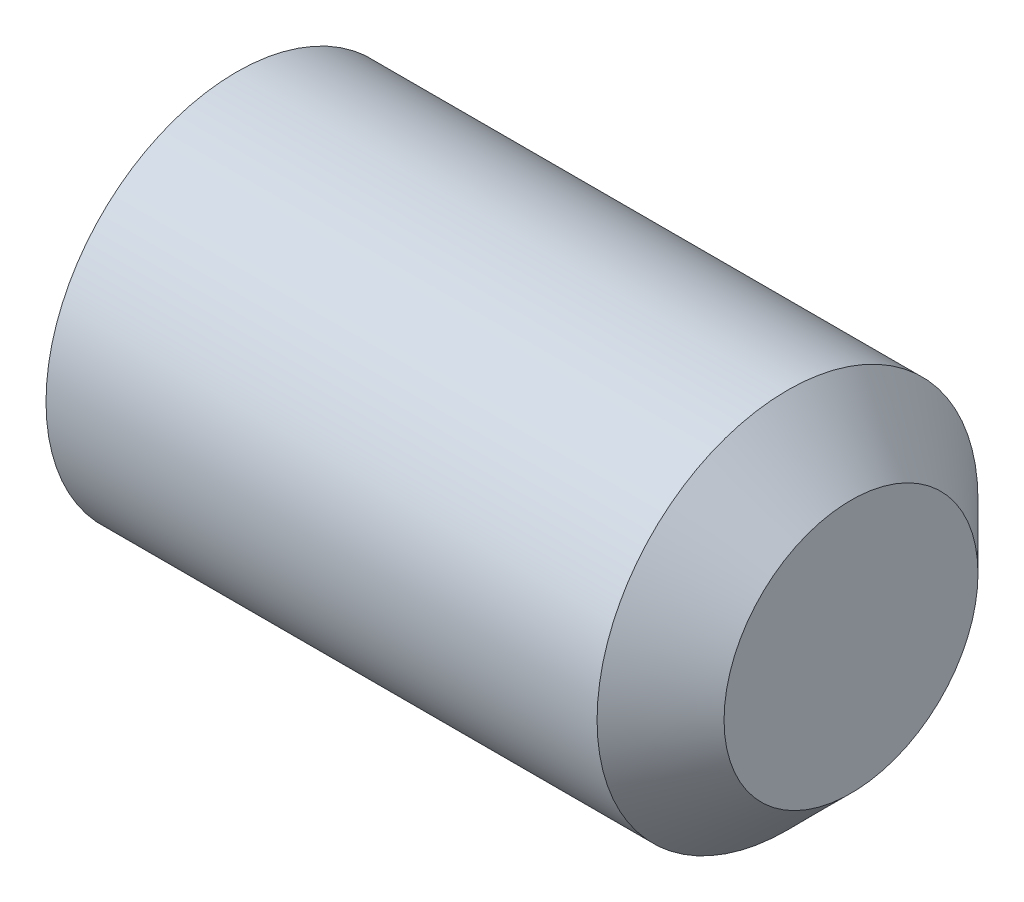
ISO-10303-21;
HEADER;
FILE_DESCRIPTION(('STEP AP214'),'2;1');
FILE_NAME('part.step','',(''),(''),'','','');
FILE_SCHEMA(('AUTOMOTIVE_DESIGN { 1 0 10303 214 1 1 1 1 }'));
ENDSEC;
DATA;
#1=APPLICATION_CONTEXT('core data for automotive mechanical design processes');
#2=APPLICATION_PROTOCOL_DEFINITION('international standard','automotive_design',2000,#1);
#3=PRODUCT_CONTEXT('',#1,'mechanical');
#4=PRODUCT('Part','Part','',(#3));
#5=PRODUCT_RELATED_PRODUCT_CATEGORY('part','',(#4));
#6=PRODUCT_DEFINITION_FORMATION('','',#4);
#7=PRODUCT_DEFINITION_CONTEXT('part definition',#1,'design');
#8=PRODUCT_DEFINITION('design','',#6,#7);
#9=PRODUCT_DEFINITION_SHAPE('','',#8);
#10=(LENGTH_UNIT() NAMED_UNIT(*) SI_UNIT(.MILLI.,.METRE.));
#11=(NAMED_UNIT(*) PLANE_ANGLE_UNIT() SI_UNIT($,.RADIAN.));
#12=(NAMED_UNIT(*) SI_UNIT($,.STERADIAN.) SOLID_ANGLE_UNIT());
#13=UNCERTAINTY_MEASURE_WITH_UNIT(LENGTH_MEASURE(1.E-05),#10,'distance_accuracy_value','');
#14=(GEOMETRIC_REPRESENTATION_CONTEXT(3) GLOBAL_UNCERTAINTY_ASSIGNED_CONTEXT((#13)) GLOBAL_UNIT_ASSIGNED_CONTEXT((#10,
#11,#12)) REPRESENTATION_CONTEXT('',''));
#15=CARTESIAN_POINT('',(0.,0.,0.));
#16=DIRECTION('',(0.,0.,1.));
#17=DIRECTION('',(1.,0.,0.));
#18=AXIS2_PLACEMENT_3D('',#15,#16,#17);
#19=CARTESIAN_POINT('',(0.,0.,0.));
#20=DIRECTION('',(-0.999999999999996,0.,0.));
#21=DIRECTION('',(0.,0.,0.999999999999996));
#22=AXIS2_PLACEMENT_3D('',#19,#20,#21);
#23=PLANE('',#22);
#24=CARTESIAN_POINT('',(0.,0.,0.));
#25=DIRECTION('',(-0.999999999999996,0.,0.));
#26=DIRECTION('',(0.,0.,0.999999999999996));
#27=AXIS2_PLACEMENT_3D('',#24,#25,#26);
#28=CIRCLE('',#27,2.4455);
#29=CARTESIAN_POINT('',(0.,0.,2.44549999999999));
#30=VERTEX_POINT('',#29);
#31=EDGE_CURVE('E138',#30,#30,#28,.T.);
#32=ORIENTED_EDGE('',*,*,#31,.T.);
#33=EDGE_LOOP('',(#32));
#34=FACE_BOUND('',#33,.T.);
#35=DIRECTION('',(0.,0.,-0.999999999999996));
#36=VECTOR('',#35,1.);
#37=CARTESIAN_POINT('',(0.,1.49999999999999,0.866025403784424));
#38=LINE('',#37,#36);
#39=CARTESIAN_POINT('',(0.,1.49999999999999,0.866025403784424));
#40=VERTEX_POINT('',#39);
#41=CARTESIAN_POINT('',(0.,1.49999999999998,-0.86602540378446));
#42=VERTEX_POINT('',#41);
#43=EDGE_CURVE('E129',#40,#42,#38,.T.);
#44=ORIENTED_EDGE('',*,*,#43,.F.);
#45=DIRECTION('',(0.,-0.86602540378444,0.499999999999998));
#46=VECTOR('',#45,1.);
#47=CARTESIAN_POINT('',(0.,1.49999999999999,0.866025403784424));
#48=LINE('',#47,#46);
#49=CARTESIAN_POINT('',(0.,0.,1.73205080756886));
#50=VERTEX_POINT('',#49);
#51=EDGE_CURVE('E51',#40,#50,#48,.T.);
#52=ORIENTED_EDGE('',*,*,#51,.T.);
#53=DIRECTION('',(0.,0.866025403784441,0.499999999999998));
#54=VECTOR('',#53,1.);
#55=CARTESIAN_POINT('',(0.,-1.50000000000002,0.866025403784419));
#56=LINE('',#55,#54);
#57=CARTESIAN_POINT('',(0.,-1.50000000000002,0.866025403784419));
#58=VERTEX_POINT('',#57);
#59=EDGE_CURVE('E120',#58,#50,#56,.T.);
#60=ORIENTED_EDGE('',*,*,#59,.F.);
#61=DIRECTION('',(0.,0.,-0.999999999999996));
#62=VECTOR('',#61,1.);
#63=CARTESIAN_POINT('',(0.,-1.50000000000002,0.866025403784419));
#64=LINE('',#63,#62);
#65=CARTESIAN_POINT('',(1.11022302462516E-13,-1.50000000000002,-0.866025403784436));
#66=VERTEX_POINT('',#65);
#67=EDGE_CURVE('E123',#58,#66,#64,.T.);
#68=ORIENTED_EDGE('',*,*,#67,.T.);
#69=DIRECTION('',(0.,0.86602540378444,-0.499999999999998));
#70=VECTOR('',#69,1.);
#71=CARTESIAN_POINT('',(1.11022302462516E-13,-1.50000000000002,-0.866025403784436));
#72=LINE('',#71,#70);
#73=CARTESIAN_POINT('',(1.66533453693773E-13,0.,-1.73205080756889));
#74=VERTEX_POINT('',#73);
#75=EDGE_CURVE('E126',#66,#74,#72,.T.);
#76=ORIENTED_EDGE('',*,*,#75,.T.);
#77=DIRECTION('',(0.,-0.86602540378444,-0.499999999999998));
#78=VECTOR('',#77,1.);
#79=CARTESIAN_POINT('',(0.,1.49999999999998,-0.86602540378446));
#80=LINE('',#79,#78);
#81=EDGE_CURVE('E109',#42,#74,#80,.T.);
#82=ORIENTED_EDGE('',*,*,#81,.F.);
#83=EDGE_LOOP('',(#44,#52,#60,#68,#76,#82));
#84=FACE_BOUND('',#83,.T.);
#85=ADVANCED_FACE('F36',(#34,#84),#23,.T.);
#86=CARTESIAN_POINT('',(10.,2.00000000000001,0.));
#87=DIRECTION('',(0.999999999999996,0.,0.));
#88=DIRECTION('',(0.,0.,-0.999999999999996));
#89=AXIS2_PLACEMENT_3D('',#86,#87,#88);
#90=PLANE('',#89);
#91=CARTESIAN_POINT('',(10.,0.,0.));
#92=DIRECTION('',(-0.999999999999996,0.,0.));
#93=DIRECTION('',(0.,0.,0.999999999999996));
#94=AXIS2_PLACEMENT_3D('',#91,#92,#93);
#95=CIRCLE('',#94,2.);
#96=CARTESIAN_POINT('',(10.,0.,1.99999999999998));
#97=VERTEX_POINT('',#96);
#98=EDGE_CURVE('E11',#97,#97,#95,.T.);
#99=ORIENTED_EDGE('',*,*,#98,.F.);
#100=EDGE_LOOP('',(#99));
#101=FACE_BOUND('',#100,.T.);
#102=ADVANCED_FACE('F38',(#101),#90,.T.);
#103=CARTESIAN_POINT('',(9.00000000000004,0.,0.));
#104=DIRECTION('',(-0.999999999999996,0.,0.));
#105=DIRECTION('',(0.,0.,0.999999999999996));
#106=AXIS2_PLACEMENT_3D('',#103,#104,#105);
#107=CONICAL_SURFACE('',#106,3.,0.785398163397464);
#108=CARTESIAN_POINT('',(9.00000000000004,0.,0.));
#109=DIRECTION('',(-0.999999999999996,0.,0.));
#110=DIRECTION('',(0.,0.,0.999999999999996));
#111=AXIS2_PLACEMENT_3D('',#108,#109,#110);
#112=CIRCLE('',#111,3.);
#113=CARTESIAN_POINT('',(9.00000000000004,0.,2.99999999999998));
#114=VERTEX_POINT('',#113);
#115=EDGE_CURVE('E44',#114,#114,#112,.T.);
#116=CARTESIAN_POINT('',(10.,0.,1.99999999999998));
#117=CARTESIAN_POINT('',(9.98958333333334,0.,2.01041666666665));
#118=CARTESIAN_POINT('',(9.97916666666667,0.,2.02083333333331));
#119=CARTESIAN_POINT('',(9.95833333333334,0.,2.04166666666665));
#120=CARTESIAN_POINT('',(9.94791666666667,0.,2.05208333333332));
#121=CARTESIAN_POINT('',(9.92708333333334,0.,2.07291666666665));
#122=CARTESIAN_POINT('',(9.91666666666667,0.,2.08333333333331));
#123=CARTESIAN_POINT('',(9.89583333333334,0.,2.10416666666665));
#124=CARTESIAN_POINT('',(9.88541666666667,0.,2.11458333333331));
#125=CARTESIAN_POINT('',(9.86458333333334,0.,2.13541666666665));
#126=CARTESIAN_POINT('',(9.85416666666667,0.,2.14583333333331));
#127=CARTESIAN_POINT('',(9.83333333333334,0.,2.16666666666665));
#128=CARTESIAN_POINT('',(9.82291666666668,0.,2.17708333333331));
#129=CARTESIAN_POINT('',(9.80208333333334,0.,2.19791666666665));
#130=CARTESIAN_POINT('',(9.79166666666668,0.,2.20833333333331));
#131=CARTESIAN_POINT('',(9.77083333333334,0.,2.22916666666665));
#132=CARTESIAN_POINT('',(9.76041666666668,0.,2.23958333333331));
#133=CARTESIAN_POINT('',(9.73958333333334,0.,2.26041666666665));
#134=CARTESIAN_POINT('',(9.72916666666668,0.,2.27083333333331));
#135=CARTESIAN_POINT('',(9.70833333333335,0.,2.29166666666665));
#136=CARTESIAN_POINT('',(9.69791666666668,0.,2.30208333333331));
#137=CARTESIAN_POINT('',(9.67708333333335,0.,2.32291666666665));
#138=CARTESIAN_POINT('',(9.66666666666668,0.,2.33333333333331));
#139=CARTESIAN_POINT('',(9.64583333333335,0.,2.35416666666665));
#140=CARTESIAN_POINT('',(9.63541666666668,0.,2.36458333333331));
#141=CARTESIAN_POINT('',(9.61458333333335,0.,2.38541666666665));
#142=CARTESIAN_POINT('',(9.60416666666668,0.,2.39583333333331));
#143=CARTESIAN_POINT('',(9.58333333333335,0.,2.41666666666665));
#144=CARTESIAN_POINT('',(9.57291666666668,0.,2.42708333333331));
#145=CARTESIAN_POINT('',(9.55208333333335,0.,2.44791666666665));
#146=CARTESIAN_POINT('',(9.54166666666668,0.,2.45833333333331));
#147=CARTESIAN_POINT('',(9.52083333333335,0.,2.47916666666665));
#148=CARTESIAN_POINT('',(9.51041666666669,0.,2.48958333333331));
#149=CARTESIAN_POINT('',(9.48958333333335,0.,2.51041666666665));
#150=CARTESIAN_POINT('',(9.47916666666669,0.,2.52083333333331));
#151=CARTESIAN_POINT('',(9.45833333333336,0.,2.54166666666665));
#152=CARTESIAN_POINT('',(9.44791666666669,0.,2.55208333333331));
#153=CARTESIAN_POINT('',(9.42708333333336,0.,2.57291666666665));
#154=CARTESIAN_POINT('',(9.41666666666669,0.,2.58333333333331));
#155=CARTESIAN_POINT('',(9.39583333333336,0.,2.60416666666665));
#156=CARTESIAN_POINT('',(9.38541666666669,0.,2.61458333333331));
#157=CARTESIAN_POINT('',(9.36458333333336,0.,2.63541666666665));
#158=CARTESIAN_POINT('',(9.35416666666669,0.,2.64583333333331));
#159=CARTESIAN_POINT('',(9.33333333333336,0.,2.66666666666665));
#160=CARTESIAN_POINT('',(9.32291666666669,0.,2.67708333333331));
#161=CARTESIAN_POINT('',(9.30208333333336,0.,2.69791666666665));
#162=CARTESIAN_POINT('',(9.29166666666669,0.,2.70833333333331));
#163=CARTESIAN_POINT('',(9.27083333333336,0.,2.72916666666665));
#164=CARTESIAN_POINT('',(9.26041666666669,0.,2.73958333333331));
#165=CARTESIAN_POINT('',(9.23958333333336,0.,2.76041666666665));
#166=CARTESIAN_POINT('',(9.2291666666667,0.,2.77083333333331));
#167=CARTESIAN_POINT('',(9.20833333333336,0.,2.79166666666665));
#168=CARTESIAN_POINT('',(9.1979166666667,0.,2.80208333333331));
#169=CARTESIAN_POINT('',(9.17708333333336,0.,2.82291666666665));
#170=CARTESIAN_POINT('',(9.1666666666667,0.,2.83333333333331));
#171=CARTESIAN_POINT('',(9.14583333333337,0.,2.85416666666665));
#172=CARTESIAN_POINT('',(9.1354166666667,0.,2.86458333333331));
#173=CARTESIAN_POINT('',(9.11458333333337,0.,2.88541666666665));
#174=CARTESIAN_POINT('',(9.1041666666667,0.,2.89583333333331));
#175=CARTESIAN_POINT('',(9.08333333333337,0.,2.91666666666665));
#176=CARTESIAN_POINT('',(9.0729166666667,0.,2.92708333333331));
#177=CARTESIAN_POINT('',(9.05208333333337,0.,2.94791666666665));
#178=CARTESIAN_POINT('',(9.0416666666667,0.,2.95833333333331));
#179=CARTESIAN_POINT('',(9.02083333333337,0.,2.97916666666665));
#180=CARTESIAN_POINT('',(9.0104166666667,0.,2.98958333333331));
#181=CARTESIAN_POINT('',(9.00000000000004,0.,2.99999999999998));
#182=B_SPLINE_CURVE_WITH_KNOTS('',3,(#116,#117,#118,#119,#120,#121,#122,#123,#124,#125,#126,
#127,#128,#129,#130,#131,#132,#133,#134,#135,#136,#137,#138,#139,#140,#141,#142,#143,#144,#145,
#146,#147,#148,#149,#150,#151,#152,#153,#154,#155,#156,#157,#158,#159,#160,#161,#162,#163,#164,
#165,#166,#167,#168,#169,#170,#171,#172,#173,#174,#175,#176,#177,#178,#179,#180,#181),
.UNSPECIFIED.,.F.,.F.,(4,2,2,2,2,2,2,2,2,2,2,2,2,2,2,2,2,2,2,2,2,2,2,2,2,2,2,2,2,2,2,2,4),(0.,
0.0441941738241577,0.0883883476483158,0.132582521472475,0.176776695296633,0.220970869120791,
0.26516504294495,0.309359216769108,0.353553390593267,0.397747564417425,0.441941738241583,
0.486135912065742,0.5303300858899,0.574524259714058,0.618718433538217,0.662912607362376,
0.707106781186535,0.751300955010693,0.795495128834851,0.83968930265901,0.883883476483168,
0.928077650307326,0.972271824131485,1.01646599795564,1.0606601717798,1.10485434560396,
1.14904851942812,1.19324269325228,1.23743686707643,1.28163104090059,1.32582521472475,
1.37001938854891,1.41421356237307),.UNSPECIFIED.);
#183=EDGE_CURVE('BSEAM149',#97,#114,#182,.T.);
#184=ORIENTED_EDGE('',*,*,#98,.T.);
#185=ORIENTED_EDGE('',*,*,#115,.F.);
#186=ORIENTED_EDGE('',*,*,#183,.T.);
#187=ORIENTED_EDGE('',*,*,#183,.F.);
#188=EDGE_LOOP('',(#184,#186,#185,#187));
#189=FACE_BOUND('',#188,.T.);
#190=ADVANCED_FACE('F149',(#189),#107,.T.);
#191=CARTESIAN_POINT('',(-12.7,0.,0.));
#192=DIRECTION('',(-0.999999999999996,0.,0.));
#193=DIRECTION('',(0.,0.,0.999999999999996));
#194=AXIS2_PLACEMENT_3D('',#191,#192,#193);
#195=CYLINDRICAL_SURFACE('',#194,3.);
#196=CARTESIAN_POINT('',(0.320140724265644,0.,0.));
#197=DIRECTION('',(-0.999999999999996,0.,0.));
#198=DIRECTION('',(0.,0.,0.999999999999996));
#199=AXIS2_PLACEMENT_3D('',#196,#197,#198);
#200=CIRCLE('',#199,3.);
#201=CARTESIAN_POINT('',(0.320140724265646,0.,2.99999999999999));
#202=VERTEX_POINT('',#201);
#203=EDGE_CURVE('E141',#202,#202,#200,.T.);
#204=CARTESIAN_POINT('',(9.00000000000004,0.,2.99999999999999));
#205=CARTESIAN_POINT('',(8.90958479921114,0.,2.99999999999999));
#206=CARTESIAN_POINT('',(8.81916959842223,0.,2.99999999999999));
#207=CARTESIAN_POINT('',(8.63833919684443,0.,2.99999999999999));
#208=CARTESIAN_POINT('',(8.54792399605553,0.,2.99999999999999));
#209=CARTESIAN_POINT('',(8.36709359447774,0.,2.99999999999999));
#210=CARTESIAN_POINT('',(8.27667839368884,0.,2.99999999999999));
#211=CARTESIAN_POINT('',(8.09584799211104,0.,2.99999999999999));
#212=CARTESIAN_POINT('',(8.00543279132214,0.,2.99999999999999));
#213=CARTESIAN_POINT('',(7.82460238974434,0.,2.99999999999999));
#214=CARTESIAN_POINT('',(7.73418718895544,0.,2.99999999999999));
#215=CARTESIAN_POINT('',(7.55335678737764,0.,2.99999999999999));
#216=CARTESIAN_POINT('',(7.46294158658874,0.,2.99999999999999));
#217=CARTESIAN_POINT('',(7.28211118501094,0.,2.99999999999999));
#218=CARTESIAN_POINT('',(7.19169598422204,0.,2.99999999999999));
#219=CARTESIAN_POINT('',(7.01086558264424,0.,2.99999999999999));
#220=CARTESIAN_POINT('',(6.92045038185534,0.,2.99999999999999));
#221=CARTESIAN_POINT('',(6.73961998027754,0.,2.99999999999999));
#222=CARTESIAN_POINT('',(6.64920477948864,0.,2.99999999999999));
#223=CARTESIAN_POINT('',(6.46837437791084,0.,2.99999999999999));
#224=CARTESIAN_POINT('',(6.37795917712194,0.,2.99999999999999));
#225=CARTESIAN_POINT('',(6.19712877554414,0.,2.99999999999999));
#226=CARTESIAN_POINT('',(6.10671357475524,0.,2.99999999999999));
#227=CARTESIAN_POINT('',(5.92588317317744,0.,2.99999999999999));
#228=CARTESIAN_POINT('',(5.83546797238854,0.,2.99999999999999));
#229=CARTESIAN_POINT('',(5.65463757081074,0.,2.99999999999999));
#230=CARTESIAN_POINT('',(5.56422237002184,0.,2.99999999999999));
#231=CARTESIAN_POINT('',(5.38339196844404,0.,2.99999999999999));
#232=CARTESIAN_POINT('',(5.29297676765514,0.,2.99999999999999));
#233=CARTESIAN_POINT('',(5.11214636607734,0.,2.99999999999999));
#234=CARTESIAN_POINT('',(5.02173116528844,0.,2.99999999999999));
#235=CARTESIAN_POINT('',(4.84090076371064,0.,2.99999999999999));
#236=CARTESIAN_POINT('',(4.75048556292174,0.,2.99999999999999));
#237=CARTESIAN_POINT('',(4.56965516134394,0.,2.99999999999999));
#238=CARTESIAN_POINT('',(4.47923996055504,0.,2.99999999999999));
#239=CARTESIAN_POINT('',(4.29840955897724,0.,2.99999999999999));
#240=CARTESIAN_POINT('',(4.20799435818834,0.,2.99999999999999));
#241=CARTESIAN_POINT('',(4.02716395661054,0.,2.99999999999999));
#242=CARTESIAN_POINT('',(3.93674875582164,0.,2.99999999999999));
#243=CARTESIAN_POINT('',(3.75591835424384,0.,2.99999999999999));
#244=CARTESIAN_POINT('',(3.66550315345494,0.,2.99999999999999));
#245=CARTESIAN_POINT('',(3.48467275187714,0.,2.99999999999999));
#246=CARTESIAN_POINT('',(3.39425755108824,0.,2.99999999999999));
#247=CARTESIAN_POINT('',(3.21342714951044,0.,2.99999999999999));
#248=CARTESIAN_POINT('',(3.12301194872154,0.,2.99999999999999));
#249=CARTESIAN_POINT('',(2.94218154714374,0.,2.99999999999999));
#250=CARTESIAN_POINT('',(2.85176634635484,0.,2.99999999999999));
#251=CARTESIAN_POINT('',(2.67093594477704,0.,2.99999999999999));
#252=CARTESIAN_POINT('',(2.58052074398814,0.,2.99999999999999));
#253=CARTESIAN_POINT('',(2.39969034241034,0.,2.99999999999999));
#254=CARTESIAN_POINT('',(2.30927514162144,0.,2.99999999999999));
#255=CARTESIAN_POINT('',(2.12844474004364,0.,2.99999999999999));
#256=CARTESIAN_POINT('',(2.03802953925474,0.,2.99999999999999));
#257=CARTESIAN_POINT('',(1.85719913767694,0.,2.99999999999999));
#258=CARTESIAN_POINT('',(1.76678393688805,0.,2.99999999999999));
#259=CARTESIAN_POINT('',(1.58595353531025,0.,2.99999999999999));
#260=CARTESIAN_POINT('',(1.49553833452135,0.,2.99999999999999));
#261=CARTESIAN_POINT('',(1.31470793294354,0.,2.99999999999999));
#262=CARTESIAN_POINT('',(1.22429273215464,0.,2.99999999999999));
#263=CARTESIAN_POINT('',(1.04346233057684,0.,2.99999999999999));
#264=CARTESIAN_POINT('',(0.953047129787945,0.,2.99999999999999));
#265=CARTESIAN_POINT('',(0.772216728210146,0.,2.99999999999999));
#266=CARTESIAN_POINT('',(0.681801527421247,0.,2.99999999999999));
#267=CARTESIAN_POINT('',(0.500971125843447,0.,2.99999999999999));
#268=CARTESIAN_POINT('',(0.410555925054546,0.,2.99999999999999));
#269=CARTESIAN_POINT('',(0.320140724265646,0.,2.99999999999999));
#270=B_SPLINE_CURVE_WITH_KNOTS('',3,(#204,#205,#206,#207,#208,#209,#210,#211,#212,#213,#214,
#215,#216,#217,#218,#219,#220,#221,#222,#223,#224,#225,#226,#227,#228,#229,#230,#231,#232,#233,
#234,#235,#236,#237,#238,#239,#240,#241,#242,#243,#244,#245,#246,#247,#248,#249,#250,#251,#252,
#253,#254,#255,#256,#257,#258,#259,#260,#261,#262,#263,#264,#265,#266,#267,#268,#269),
.UNSPECIFIED.,.F.,.F.,(4,2,2,2,2,2,2,2,2,2,2,2,2,2,2,2,2,2,2,2,2,2,2,2,2,2,2,2,2,2,2,2,4),(0.,
0.271245602366701,0.542491204733403,0.813736807100097,1.0849824094668,1.3562280118335,
1.6274736142002,1.8987192165669,2.1699648189336,2.4412104213003,2.712456023667,2.9837016260337,
3.2549472284004,3.5261928307671,3.79743843313379,4.06868403550049,4.3399296378672,
4.61117524023389,4.8824208426006,5.15366644496729,5.42491204733399,5.69615764970069,
5.96740325206739,6.23864885443409,6.50989445680079,6.78114005916749,7.05238566153419,
7.32363126390089,7.59487686626759,7.86612246863429,8.13736807100099,8.40861367336769,
8.67985927573439),.UNSPECIFIED.);
#271=EDGE_CURVE('BSEAM146',#114,#202,#270,.T.);
#272=ORIENTED_EDGE('',*,*,#115,.T.);
#273=ORIENTED_EDGE('',*,*,#203,.F.);
#274=ORIENTED_EDGE('',*,*,#271,.T.);
#275=ORIENTED_EDGE('',*,*,#271,.F.);
#276=EDGE_LOOP('',(#272,#274,#273,#275));
#277=FACE_BOUND('',#276,.T.);
#278=ADVANCED_FACE('F146',(#277),#195,.T.);
#279=CARTESIAN_POINT('',(0.,0.,0.));
#280=DIRECTION('',(0.999999999999996,0.,0.));
#281=DIRECTION('',(0.,0.,-0.999999999999996));
#282=AXIS2_PLACEMENT_3D('',#279,#280,#281);
#283=CONICAL_SURFACE('',#282,2.4455,1.0471975511966);
#284=ORIENTED_EDGE('',*,*,#203,.T.);
#285=EDGE_LOOP('',(#284));
#286=FACE_BOUND('',#285,.T.);
#287=ORIENTED_EDGE('',*,*,#31,.F.);
#288=EDGE_LOOP('',(#287));
#289=FACE_BOUND('',#288,.T.);
#290=ADVANCED_FACE('F156',(#286,#289),#283,.T.);
#291=CARTESIAN_POINT('',(3.50000000000004,1.5,0.866025403784439));
#292=DIRECTION('',(0.,-0.5,-0.866025403784435));
#293=DIRECTION('',(0.,0.86602540378444,-0.499999999999998));
#294=AXIS2_PLACEMENT_3D('',#291,#292,#293);
#295=PLANE('',#294);
#296=ORIENTED_EDGE('',*,*,#51,.F.);
#297=DIRECTION('',(-0.999999999999996,0.,0.));
#298=VECTOR('',#297,1.);
#299=CARTESIAN_POINT('',(3.50000000000004,1.5,0.866025403784439));
#300=LINE('',#299,#298);
#301=CARTESIAN_POINT('',(3.50000000000004,1.5,0.866025403784439));
#302=VERTEX_POINT('',#301);
#303=EDGE_CURVE('E56',#302,#40,#300,.T.);
#304=ORIENTED_EDGE('',*,*,#303,.F.);
#305=DIRECTION('',(0.,-0.86602540378444,0.499999999999998));
#306=VECTOR('',#305,1.);
#307=CARTESIAN_POINT('',(3.50000000000004,1.5,0.866025403784439));
#308=LINE('',#307,#306);
#309=CARTESIAN_POINT('',(3.50000000000004,0.,1.73205080756888));
#310=VERTEX_POINT('',#309);
#311=EDGE_CURVE('E83',#302,#310,#308,.T.);
#312=ORIENTED_EDGE('',*,*,#311,.T.);
#313=DIRECTION('',(-0.999999999999996,0.,0.));
#314=VECTOR('',#313,1.);
#315=CARTESIAN_POINT('',(3.50000000000004,0.,1.73205080756888));
#316=LINE('',#315,#314);
#317=EDGE_CURVE('E136',#310,#50,#316,.T.);
#318=ORIENTED_EDGE('',*,*,#317,.T.);
#319=EDGE_LOOP('',(#296,#304,#312,#318));
#320=FACE_BOUND('',#319,.T.);
#321=ADVANCED_FACE('F167',(#320),#295,.T.);
#322=CARTESIAN_POINT('',(3.5,-1.50000000000002,0.866025403784415));
#323=DIRECTION('',(0.,-0.5,0.866025403784435));
#324=DIRECTION('',(0.,-0.86602540378444,-0.499999999999999));
#325=AXIS2_PLACEMENT_3D('',#322,#323,#324);
#326=PLANE('',#325);
#327=ORIENTED_EDGE('',*,*,#59,.T.);
#328=ORIENTED_EDGE('',*,*,#317,.F.);
#329=DIRECTION('',(0.,0.866025403784441,0.499999999999998));
#330=VECTOR('',#329,1.);
#331=CARTESIAN_POINT('',(3.5,-1.50000000000002,0.866025403784415));
#332=LINE('',#331,#330);
#333=CARTESIAN_POINT('',(3.5,-1.50000000000002,0.866025403784415));
#334=VERTEX_POINT('',#333);
#335=EDGE_CURVE('E267',#334,#310,#332,.T.);
#336=ORIENTED_EDGE('',*,*,#335,.F.);
#337=DIRECTION('',(-0.999999999999996,0.,0.));
#338=VECTOR('',#337,1.);
#339=CARTESIAN_POINT('',(3.5,-1.50000000000002,0.866025403784415));
#340=LINE('',#339,#338);
#341=EDGE_CURVE('E134',#334,#58,#340,.T.);
#342=ORIENTED_EDGE('',*,*,#341,.T.);
#343=EDGE_LOOP('',(#327,#328,#336,#342));
#344=FACE_BOUND('',#343,.T.);
#345=ADVANCED_FACE('F174',(#344),#326,.F.);
#346=CARTESIAN_POINT('',(3.5,-1.50000000000002,0.866025403784415));
#347=DIRECTION('',(0.,1.,0.));
#348=DIRECTION('',(0.,0.,0.999999999999996));
#349=AXIS2_PLACEMENT_3D('',#346,#347,#348);
#350=PLANE('',#349);
#351=ORIENTED_EDGE('',*,*,#67,.F.);
#352=ORIENTED_EDGE('',*,*,#341,.F.);
#353=DIRECTION('',(0.,0.,-0.999999999999996));
#354=VECTOR('',#353,1.);
#355=CARTESIAN_POINT('',(3.5,-1.50000000000002,0.866025403784415));
#356=LINE('',#355,#354);
#357=CARTESIAN_POINT('',(3.5,-1.50000000000001,-0.866025403784436));
#358=VERTEX_POINT('',#357);
#359=EDGE_CURVE('E104',#334,#358,#356,.T.);
#360=ORIENTED_EDGE('',*,*,#359,.T.);
#361=DIRECTION('',(-0.999999999999996,0.,0.));
#362=VECTOR('',#361,1.);
#363=CARTESIAN_POINT('',(3.5,-1.50000000000001,-0.866025403784436));
#364=LINE('',#363,#362);
#365=EDGE_CURVE('E99',#358,#66,#364,.T.);
#366=ORIENTED_EDGE('',*,*,#365,.T.);
#367=EDGE_LOOP('',(#351,#352,#360,#366));
#368=FACE_BOUND('',#367,.T.);
#369=ADVANCED_FACE('F181',(#368),#350,.T.);
#370=CARTESIAN_POINT('',(3.5,-1.50000000000001,-0.866025403784436));
#371=DIRECTION('',(0.,0.500000000000001,0.866025403784435));
#372=DIRECTION('',(0.,-0.86602540378444,0.499999999999998));
#373=AXIS2_PLACEMENT_3D('',#370,#371,#372);
#374=PLANE('',#373);
#375=ORIENTED_EDGE('',*,*,#75,.F.);
#376=ORIENTED_EDGE('',*,*,#365,.F.);
#377=DIRECTION('',(0.,0.86602540378444,-0.499999999999998));
#378=VECTOR('',#377,1.);
#379=CARTESIAN_POINT('',(3.5,-1.50000000000001,-0.866025403784436));
#380=LINE('',#379,#378);
#381=CARTESIAN_POINT('',(3.5,0.,-1.73205080756889));
#382=VERTEX_POINT('',#381);
#383=EDGE_CURVE('E94',#358,#382,#380,.T.);
#384=ORIENTED_EDGE('',*,*,#383,.T.);
#385=DIRECTION('',(-0.999999999999996,0.,0.));
#386=VECTOR('',#385,1.);
#387=CARTESIAN_POINT('',(3.5,0.,-1.73205080756889));
#388=LINE('',#387,#386);
#389=EDGE_CURVE('E98',#382,#74,#388,.T.);
#390=ORIENTED_EDGE('',*,*,#389,.T.);
#391=EDGE_LOOP('',(#375,#376,#384,#390));
#392=FACE_BOUND('',#391,.T.);
#393=ADVANCED_FACE('F97',(#392),#374,.T.);
#394=CARTESIAN_POINT('',(3.50000000000004,1.5,-0.866025403784443));
#395=DIRECTION('',(0.,0.5,-0.866025403784435));
#396=DIRECTION('',(0.,0.86602540378444,0.499999999999999));
#397=AXIS2_PLACEMENT_3D('',#394,#395,#396);
#398=PLANE('',#397);
#399=ORIENTED_EDGE('',*,*,#81,.T.);
#400=ORIENTED_EDGE('',*,*,#389,.F.);
#401=DIRECTION('',(0.,-0.86602540378444,-0.499999999999998));
#402=VECTOR('',#401,1.);
#403=CARTESIAN_POINT('',(3.50000000000004,1.5,-0.866025403784443));
#404=LINE('',#403,#402);
#405=CARTESIAN_POINT('',(3.50000000000004,1.5,-0.866025403784443));
#406=VERTEX_POINT('',#405);
#407=EDGE_CURVE('E103',#406,#382,#404,.T.);
#408=ORIENTED_EDGE('',*,*,#407,.F.);
#409=DIRECTION('',(-0.999999999999996,0.,0.));
#410=VECTOR('',#409,1.);
#411=CARTESIAN_POINT('',(3.50000000000004,1.5,-0.866025403784443));
#412=LINE('',#411,#410);
#413=EDGE_CURVE('E79',#406,#42,#412,.T.);
#414=ORIENTED_EDGE('',*,*,#413,.T.);
#415=EDGE_LOOP('',(#399,#400,#408,#414));
#416=FACE_BOUND('',#415,.T.);
#417=ADVANCED_FACE('F106',(#416),#398,.F.);
#418=CARTESIAN_POINT('',(3.50000000000004,1.5,0.866025403784439));
#419=DIRECTION('',(0.,1.,0.));
#420=DIRECTION('',(0.,0.,0.999999999999996));
#421=AXIS2_PLACEMENT_3D('',#418,#419,#420);
#422=PLANE('',#421);
#423=ORIENTED_EDGE('',*,*,#43,.T.);
#424=ORIENTED_EDGE('',*,*,#413,.F.);
#425=DIRECTION('',(0.,0.,-0.999999999999996));
#426=VECTOR('',#425,1.);
#427=CARTESIAN_POINT('',(3.50000000000004,1.5,0.866025403784439));
#428=LINE('',#427,#426);
#429=EDGE_CURVE('E114',#302,#406,#428,.T.);
#430=ORIENTED_EDGE('',*,*,#429,.F.);
#431=ORIENTED_EDGE('',*,*,#303,.T.);
#432=EDGE_LOOP('',(#423,#424,#430,#431));
#433=FACE_BOUND('',#432,.T.);
#434=ADVANCED_FACE('F193',(#433),#422,.F.);
#435=CARTESIAN_POINT('',(3.5,3.,0.));
#436=DIRECTION('',(0.999999999999996,0.,0.));
#437=DIRECTION('',(0.,0.,-0.999999999999996));
#438=AXIS2_PLACEMENT_3D('',#435,#436,#437);
#439=PLANE('',#438);
#440=ORIENTED_EDGE('',*,*,#311,.F.);
#441=ORIENTED_EDGE('',*,*,#429,.T.);
#442=ORIENTED_EDGE('',*,*,#407,.T.);
#443=ORIENTED_EDGE('',*,*,#383,.F.);
#444=ORIENTED_EDGE('',*,*,#359,.F.);
#445=ORIENTED_EDGE('',*,*,#335,.T.);
#446=EDGE_LOOP('',(#440,#441,#442,#443,#444,#445));
#447=FACE_BOUND('',#446,.T.);
#448=ADVANCED_FACE('F112',(#447),#439,.F.);
#449=CLOSED_SHELL('',(#85,#102,#190,#278,#290,#321,#345,#369,#393,#417,#434,#448));
#450=MANIFOLD_SOLID_BREP('B2',#449);
#451=ADVANCED_BREP_SHAPE_REPRESENTATION('',(#18,#450),#14);
#452=SHAPE_DEFINITION_REPRESENTATION(#9,#451);
ENDSEC;
END-ISO-10303-21;
